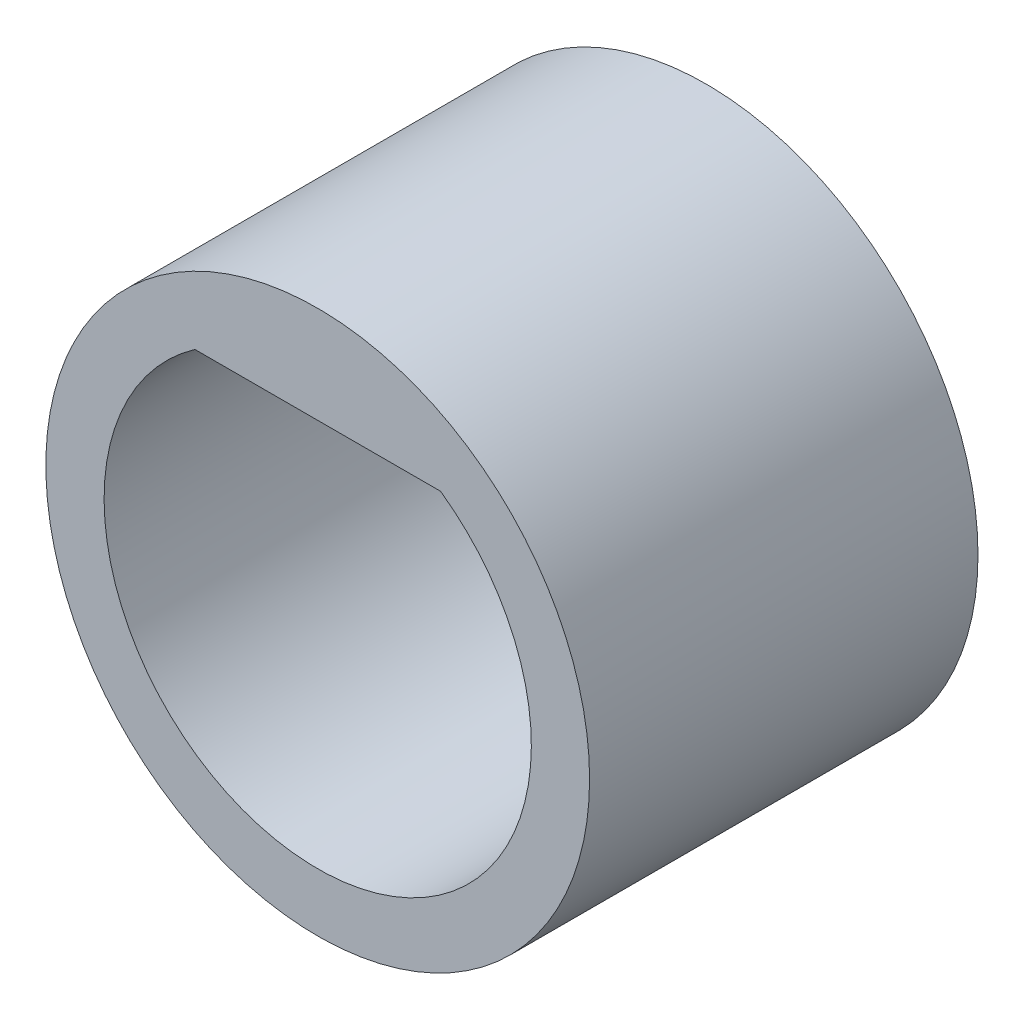
ISO-10303-21;
HEADER;
FILE_DESCRIPTION(('STEP AP214'),'2;1');
FILE_NAME('part.step','',(''),(''),'','','');
FILE_SCHEMA(('AUTOMOTIVE_DESIGN { 1 0 10303 214 1 1 1 1 }'));
ENDSEC;
DATA;
#1=APPLICATION_CONTEXT('core data for automotive mechanical design processes');
#2=APPLICATION_PROTOCOL_DEFINITION('international standard','automotive_design',2000,#1);
#3=PRODUCT_CONTEXT('',#1,'mechanical');
#4=PRODUCT('Part','Part','',(#3));
#5=PRODUCT_RELATED_PRODUCT_CATEGORY('part','',(#4));
#6=PRODUCT_DEFINITION_FORMATION('','',#4);
#7=PRODUCT_DEFINITION_CONTEXT('part definition',#1,'design');
#8=PRODUCT_DEFINITION('design','',#6,#7);
#9=PRODUCT_DEFINITION_SHAPE('','',#8);
#10=(LENGTH_UNIT() NAMED_UNIT(*) SI_UNIT(.MILLI.,.METRE.));
#11=(NAMED_UNIT(*) PLANE_ANGLE_UNIT() SI_UNIT($,.RADIAN.));
#12=(NAMED_UNIT(*) SI_UNIT($,.STERADIAN.) SOLID_ANGLE_UNIT());
#13=UNCERTAINTY_MEASURE_WITH_UNIT(LENGTH_MEASURE(1.E-05),#10,'distance_accuracy_value','');
#14=(GEOMETRIC_REPRESENTATION_CONTEXT(3) GLOBAL_UNCERTAINTY_ASSIGNED_CONTEXT((#13)) GLOBAL_UNIT_ASSIGNED_CONTEXT((#10,
#11,#12)) REPRESENTATION_CONTEXT('',''));
#15=CARTESIAN_POINT('',(0.,0.,0.));
#16=DIRECTION('',(0.,0.,1.));
#17=DIRECTION('',(1.,0.,0.));
#18=AXIS2_PLACEMENT_3D('',#15,#16,#17);
#19=CARTESIAN_POINT('',(7.22386192905789,0.,10.));
#20=DIRECTION('',(0.,0.,1.));
#21=DIRECTION('',(1.,0.,0.));
#22=AXIS2_PLACEMENT_3D('',#19,#20,#21);
#23=PLANE('',#22);
#24=CARTESIAN_POINT('',(7.22386192905789,0.,10.));
#25=DIRECTION('',(0.,0.,1.));
#26=DIRECTION('',(1.,0.,0.));
#27=AXIS2_PLACEMENT_3D('',#24,#25,#26);
#28=CIRCLE('',#27,7.);
#29=CARTESIAN_POINT('',(14.2238619290579,0.,10.));
#30=VERTEX_POINT('',#29);
#31=EDGE_CURVE('E11',#30,#30,#28,.T.);
#32=ORIENTED_EDGE('',*,*,#31,.T.);
#33=EDGE_LOOP('',(#32));
#34=FACE_BOUND('',#33,.T.);
#35=DIRECTION('',(-1.,0.,0.));
#36=VECTOR('',#35,1.);
#37=CARTESIAN_POINT('',(4.06158426888951,4.5,10.));
#38=LINE('',#37,#36);
#39=CARTESIAN_POINT('',(10.3861395892263,4.5,10.));
#40=VERTEX_POINT('',#39);
#41=CARTESIAN_POINT('',(4.06158426888951,4.5,10.));
#42=VERTEX_POINT('',#41);
#43=EDGE_CURVE('E88',#40,#42,#38,.T.);
#44=ORIENTED_EDGE('',*,*,#43,.F.);
#45=CARTESIAN_POINT('',(7.22386192905789,0.,10.));
#46=DIRECTION('',(0.,0.,1.));
#47=DIRECTION('',(1.,0.,0.));
#48=AXIS2_PLACEMENT_3D('',#45,#46,#47);
#49=CIRCLE('',#48,5.5);
#50=EDGE_CURVE('E77',#42,#40,#49,.T.);
#51=ORIENTED_EDGE('',*,*,#50,.F.);
#52=EDGE_LOOP('',(#44,#51));
#53=FACE_BOUND('',#52,.T.);
#54=ADVANCED_FACE('F43',(#34,#53),#23,.T.);
#55=CARTESIAN_POINT('',(7.22386192905789,0.,0.));
#56=DIRECTION('',(0.,0.,1.));
#57=DIRECTION('',(1.,0.,0.));
#58=AXIS2_PLACEMENT_3D('',#55,#56,#57);
#59=PLANE('',#58);
#60=CARTESIAN_POINT('',(7.22386192905789,0.,0.));
#61=DIRECTION('',(0.,0.,1.));
#62=DIRECTION('',(1.,0.,0.));
#63=AXIS2_PLACEMENT_3D('',#60,#61,#62);
#64=CIRCLE('',#63,7.);
#65=CARTESIAN_POINT('',(14.2238619290579,0.,0.));
#66=VERTEX_POINT('',#65);
#67=EDGE_CURVE('E47',#66,#66,#64,.T.);
#68=ORIENTED_EDGE('',*,*,#67,.F.);
#69=EDGE_LOOP('',(#68));
#70=FACE_BOUND('',#69,.T.);
#71=CARTESIAN_POINT('',(7.22386192905789,0.,0.));
#72=DIRECTION('',(0.,0.,1.));
#73=DIRECTION('',(1.,0.,0.));
#74=AXIS2_PLACEMENT_3D('',#71,#72,#73);
#75=CIRCLE('',#74,5.5);
#76=CARTESIAN_POINT('',(4.06158426888951,4.5,0.));
#77=VERTEX_POINT('',#76);
#78=CARTESIAN_POINT('',(10.3861395892263,4.5,0.));
#79=VERTEX_POINT('',#78);
#80=EDGE_CURVE('E66',#77,#79,#75,.T.);
#81=ORIENTED_EDGE('',*,*,#80,.T.);
#82=DIRECTION('',(-1.,0.,0.));
#83=VECTOR('',#82,1.);
#84=CARTESIAN_POINT('',(4.06158426888951,4.5,0.));
#85=LINE('',#84,#83);
#86=EDGE_CURVE('E72',#79,#77,#85,.T.);
#87=ORIENTED_EDGE('',*,*,#86,.T.);
#88=EDGE_LOOP('',(#81,#87));
#89=FACE_BOUND('',#88,.T.);
#90=ADVANCED_FACE('F84',(#70,#89),#59,.F.);
#91=CARTESIAN_POINT('',(7.22386192905789,0.,10.));
#92=DIRECTION('',(0.,0.,-1.));
#93=DIRECTION('',(-1.,0.,0.));
#94=AXIS2_PLACEMENT_3D('',#91,#92,#93);
#95=CYLINDRICAL_SURFACE('',#94,7.);
#96=ORIENTED_EDGE('',*,*,#31,.F.);
#97=EDGE_LOOP('',(#96));
#98=FACE_BOUND('',#97,.T.);
#99=ORIENTED_EDGE('',*,*,#67,.T.);
#100=EDGE_LOOP('',(#99));
#101=FACE_BOUND('',#100,.T.);
#102=ADVANCED_FACE('F45',(#98,#101),#95,.T.);
#103=CARTESIAN_POINT('',(7.22386192905789,0.,10.));
#104=DIRECTION('',(0.,0.,-1.));
#105=DIRECTION('',(-1.,0.,0.));
#106=AXIS2_PLACEMENT_3D('',#103,#104,#105);
#107=CYLINDRICAL_SURFACE('',#106,5.5);
#108=ORIENTED_EDGE('',*,*,#80,.F.);
#109=DIRECTION('',(0.,0.,-1.));
#110=VECTOR('',#109,1.);
#111=CARTESIAN_POINT('',(4.06158426888951,4.5,10.));
#112=LINE('',#111,#110);
#113=EDGE_CURVE('E74',#42,#77,#112,.T.);
#114=ORIENTED_EDGE('',*,*,#113,.F.);
#115=ORIENTED_EDGE('',*,*,#50,.T.);
#116=DIRECTION('',(0.,0.,-1.));
#117=VECTOR('',#116,1.);
#118=CARTESIAN_POINT('',(10.3861395892263,4.5,10.));
#119=LINE('',#118,#117);
#120=EDGE_CURVE('E59',#40,#79,#119,.T.);
#121=ORIENTED_EDGE('',*,*,#120,.T.);
#122=EDGE_LOOP('',(#108,#114,#115,#121));
#123=FACE_BOUND('',#122,.T.);
#124=ADVANCED_FACE('F79',(#123),#107,.F.);
#125=CARTESIAN_POINT('',(4.06158426888951,4.5,10.));
#126=DIRECTION('',(0.,-1.,0.));
#127=DIRECTION('',(0.,0.,-1.));
#128=AXIS2_PLACEMENT_3D('',#125,#126,#127);
#129=PLANE('',#128);
#130=ORIENTED_EDGE('',*,*,#86,.F.);
#131=ORIENTED_EDGE('',*,*,#120,.F.);
#132=ORIENTED_EDGE('',*,*,#43,.T.);
#133=ORIENTED_EDGE('',*,*,#113,.T.);
#134=EDGE_LOOP('',(#130,#131,#132,#133));
#135=FACE_BOUND('',#134,.T.);
#136=ADVANCED_FACE('F73',(#135),#129,.T.);
#137=CLOSED_SHELL('',(#54,#90,#102,#124,#136));
#138=MANIFOLD_SOLID_BREP('B2',#137);
#139=ADVANCED_BREP_SHAPE_REPRESENTATION('',(#18,#138),#14);
#140=SHAPE_DEFINITION_REPRESENTATION(#9,#139);
ENDSEC;
END-ISO-10303-21;
